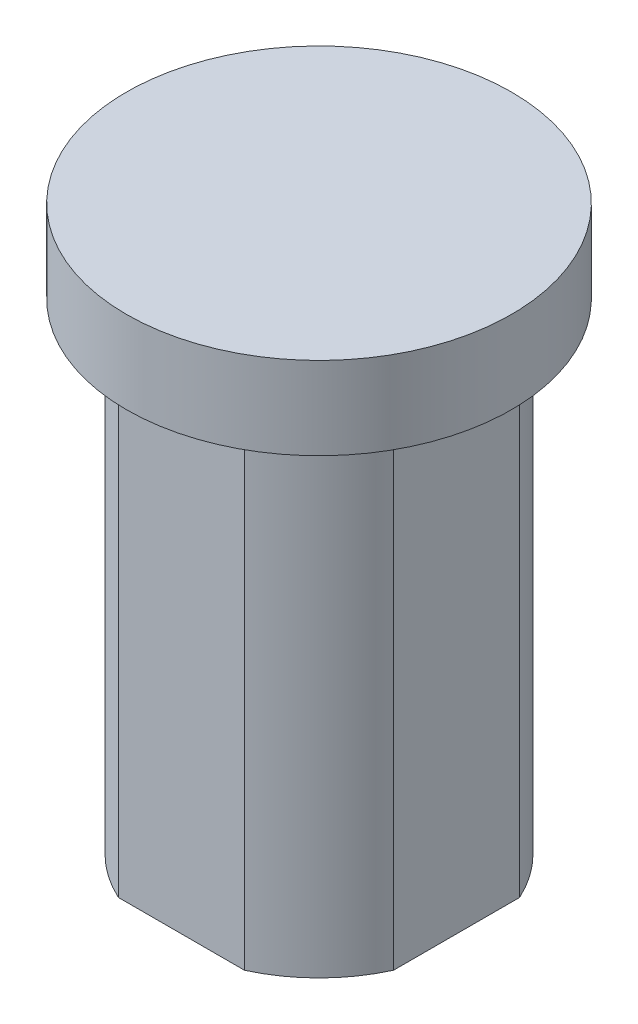
ISO-10303-21;
HEADER;
FILE_DESCRIPTION(('STEP AP214'),'2;1');
FILE_NAME('part.step','',(''),(''),'','','');
FILE_SCHEMA(('AUTOMOTIVE_DESIGN { 1 0 10303 214 1 1 1 1 }'));
ENDSEC;
DATA;
#1=APPLICATION_CONTEXT('core data for automotive mechanical design processes');
#2=APPLICATION_PROTOCOL_DEFINITION('international standard','automotive_design',2000,#1);
#3=PRODUCT_CONTEXT('',#1,'mechanical');
#4=PRODUCT('Part','Part','',(#3));
#5=PRODUCT_RELATED_PRODUCT_CATEGORY('part','',(#4));
#6=PRODUCT_DEFINITION_FORMATION('','',#4);
#7=PRODUCT_DEFINITION_CONTEXT('part definition',#1,'design');
#8=PRODUCT_DEFINITION('design','',#6,#7);
#9=PRODUCT_DEFINITION_SHAPE('','',#8);
#10=(LENGTH_UNIT() NAMED_UNIT(*) SI_UNIT(.MILLI.,.METRE.));
#11=(NAMED_UNIT(*) PLANE_ANGLE_UNIT() SI_UNIT($,.RADIAN.));
#12=(NAMED_UNIT(*) SI_UNIT($,.STERADIAN.) SOLID_ANGLE_UNIT());
#13=UNCERTAINTY_MEASURE_WITH_UNIT(LENGTH_MEASURE(1.E-05),#10,'distance_accuracy_value','');
#14=(GEOMETRIC_REPRESENTATION_CONTEXT(3) GLOBAL_UNCERTAINTY_ASSIGNED_CONTEXT((#13)) GLOBAL_UNIT_ASSIGNED_CONTEXT((#10,
#11,#12)) REPRESENTATION_CONTEXT('',''));
#15=CARTESIAN_POINT('',(0.,0.,0.));
#16=DIRECTION('',(0.,0.,1.));
#17=DIRECTION('',(1.,0.,0.));
#18=AXIS2_PLACEMENT_3D('',#15,#16,#17);
#19=CARTESIAN_POINT('',(0.,35.,0.));
#20=DIRECTION('',(0.,-1.,0.));
#21=DIRECTION('',(0.,0.,-1.));
#22=AXIS2_PLACEMENT_3D('',#19,#20,#21);
#23=CYLINDRICAL_SURFACE('',#22,11.);
#24=CARTESIAN_POINT('',(0.,0.,0.));
#25=DIRECTION('',(0.,1.,0.));
#26=DIRECTION('',(0.,0.,1.));
#27=AXIS2_PLACEMENT_3D('',#24,#25,#26);
#28=CIRCLE('',#27,11.);
#29=CARTESIAN_POINT('',(-4.58257569495584,0.,-10.));
#30=VERTEX_POINT('',#29);
#31=CARTESIAN_POINT('',(-10.,0.,-4.58257569495583));
#32=VERTEX_POINT('',#31);
#33=EDGE_CURVE('E148',#30,#32,#28,.T.);
#34=ORIENTED_EDGE('',*,*,#33,.T.);
#35=DIRECTION('',(0.,-1.,0.));
#36=VECTOR('',#35,1.);
#37=CARTESIAN_POINT('',(-10.,35.,-4.58257569495583));
#38=LINE('',#37,#36);
#39=CARTESIAN_POINT('',(-10.,35.,-4.58257569495583));
#40=VERTEX_POINT('',#39);
#41=EDGE_CURVE('E11',#40,#32,#38,.T.);
#42=ORIENTED_EDGE('',*,*,#41,.F.);
#43=CARTESIAN_POINT('',(0.,35.,0.));
#44=DIRECTION('',(0.,1.,0.));
#45=DIRECTION('',(0.,0.,1.));
#46=AXIS2_PLACEMENT_3D('',#43,#44,#45);
#47=CIRCLE('',#46,11.);
#48=CARTESIAN_POINT('',(-4.58257569495584,35.,-10.));
#49=VERTEX_POINT('',#48);
#50=EDGE_CURVE('E163',#49,#40,#47,.T.);
#51=ORIENTED_EDGE('',*,*,#50,.F.);
#52=DIRECTION('',(0.,-1.,0.));
#53=VECTOR('',#52,1.);
#54=CARTESIAN_POINT('',(-4.58257569495584,35.,-10.));
#55=LINE('',#54,#53);
#56=EDGE_CURVE('E147',#49,#30,#55,.T.);
#57=ORIENTED_EDGE('',*,*,#56,.T.);
#58=EDGE_LOOP('',(#34,#42,#51,#57));
#59=FACE_BOUND('',#58,.T.);
#60=ADVANCED_FACE('F41',(#59),#23,.T.);
#61=CARTESIAN_POINT('',(-10.,35.,4.58257569495583));
#62=DIRECTION('',(1.,0.,0.));
#63=DIRECTION('',(0.,0.,-1.));
#64=AXIS2_PLACEMENT_3D('',#61,#62,#63);
#65=PLANE('',#64);
#66=DIRECTION('',(0.,0.,1.));
#67=VECTOR('',#66,1.);
#68=CARTESIAN_POINT('',(-10.,0.,4.58257569495583));
#69=LINE('',#68,#67);
#70=CARTESIAN_POINT('',(-10.,0.,4.58257569495583));
#71=VERTEX_POINT('',#70);
#72=EDGE_CURVE('E151',#32,#71,#69,.T.);
#73=ORIENTED_EDGE('',*,*,#72,.T.);
#74=DIRECTION('',(0.,-1.,0.));
#75=VECTOR('',#74,1.);
#76=CARTESIAN_POINT('',(-10.,35.,4.58257569495583));
#77=LINE('',#76,#75);
#78=CARTESIAN_POINT('',(-10.,35.,4.58257569495583));
#79=VERTEX_POINT('',#78);
#80=EDGE_CURVE('E49',#79,#71,#77,.T.);
#81=ORIENTED_EDGE('',*,*,#80,.F.);
#82=DIRECTION('',(0.,0.,1.));
#83=VECTOR('',#82,1.);
#84=CARTESIAN_POINT('',(-10.,35.,4.58257569495583));
#85=LINE('',#84,#83);
#86=EDGE_CURVE('E99',#40,#79,#85,.T.);
#87=ORIENTED_EDGE('',*,*,#86,.F.);
#88=ORIENTED_EDGE('',*,*,#41,.T.);
#89=EDGE_LOOP('',(#73,#81,#87,#88));
#90=FACE_BOUND('',#89,.T.);
#91=ADVANCED_FACE('F209',(#90),#65,.F.);
#92=CARTESIAN_POINT('',(0.,35.,0.));
#93=DIRECTION('',(0.,-1.,0.));
#94=DIRECTION('',(0.,0.,-1.));
#95=AXIS2_PLACEMENT_3D('',#92,#93,#94);
#96=CYLINDRICAL_SURFACE('',#95,11.);
#97=CARTESIAN_POINT('',(0.,0.,0.));
#98=DIRECTION('',(0.,1.,0.));
#99=DIRECTION('',(0.,0.,1.));
#100=AXIS2_PLACEMENT_3D('',#97,#98,#99);
#101=CIRCLE('',#100,11.);
#102=CARTESIAN_POINT('',(-4.58257569495583,0.,10.));
#103=VERTEX_POINT('',#102);
#104=EDGE_CURVE('E154',#71,#103,#101,.T.);
#105=ORIENTED_EDGE('',*,*,#104,.T.);
#106=DIRECTION('',(0.,-1.,0.));
#107=VECTOR('',#106,1.);
#108=CARTESIAN_POINT('',(-4.58257569495583,35.,10.));
#109=LINE('',#108,#107);
#110=CARTESIAN_POINT('',(-4.58257569495583,35.,10.));
#111=VERTEX_POINT('',#110);
#112=EDGE_CURVE('E168',#111,#103,#109,.T.);
#113=ORIENTED_EDGE('',*,*,#112,.F.);
#114=CARTESIAN_POINT('',(0.,35.,0.));
#115=DIRECTION('',(0.,1.,0.));
#116=DIRECTION('',(0.,0.,1.));
#117=AXIS2_PLACEMENT_3D('',#114,#115,#116);
#118=CIRCLE('',#117,11.);
#119=EDGE_CURVE('E140',#79,#111,#118,.T.);
#120=ORIENTED_EDGE('',*,*,#119,.F.);
#121=ORIENTED_EDGE('',*,*,#80,.T.);
#122=EDGE_LOOP('',(#105,#113,#120,#121));
#123=FACE_BOUND('',#122,.T.);
#124=ADVANCED_FACE('F174',(#123),#96,.T.);
#125=CARTESIAN_POINT('',(4.58257569495583,35.,10.));
#126=DIRECTION('',(0.,0.,-1.));
#127=DIRECTION('',(-1.,0.,0.));
#128=AXIS2_PLACEMENT_3D('',#125,#126,#127);
#129=PLANE('',#128);
#130=DIRECTION('',(1.,0.,0.));
#131=VECTOR('',#130,1.);
#132=CARTESIAN_POINT('',(4.58257569495583,0.,10.));
#133=LINE('',#132,#131);
#134=CARTESIAN_POINT('',(4.58257569495583,0.,10.));
#135=VERTEX_POINT('',#134);
#136=EDGE_CURVE('E156',#103,#135,#133,.T.);
#137=ORIENTED_EDGE('',*,*,#136,.T.);
#138=DIRECTION('',(0.,-1.,0.));
#139=VECTOR('',#138,1.);
#140=CARTESIAN_POINT('',(4.58257569495583,35.,10.));
#141=LINE('',#140,#139);
#142=CARTESIAN_POINT('',(4.58257569495583,35.,10.));
#143=VERTEX_POINT('',#142);
#144=EDGE_CURVE('E124',#143,#135,#141,.T.);
#145=ORIENTED_EDGE('',*,*,#144,.F.);
#146=DIRECTION('',(1.,0.,0.));
#147=VECTOR('',#146,1.);
#148=CARTESIAN_POINT('',(4.58257569495583,35.,10.));
#149=LINE('',#148,#147);
#150=EDGE_CURVE('E138',#111,#143,#149,.T.);
#151=ORIENTED_EDGE('',*,*,#150,.F.);
#152=ORIENTED_EDGE('',*,*,#112,.T.);
#153=EDGE_LOOP('',(#137,#145,#151,#152));
#154=FACE_BOUND('',#153,.T.);
#155=ADVANCED_FACE('F180',(#154),#129,.F.);
#156=CARTESIAN_POINT('',(0.,35.,0.));
#157=DIRECTION('',(0.,-1.,0.));
#158=DIRECTION('',(0.,0.,-1.));
#159=AXIS2_PLACEMENT_3D('',#156,#157,#158);
#160=CYLINDRICAL_SURFACE('',#159,11.);
#161=CARTESIAN_POINT('',(0.,0.,0.));
#162=DIRECTION('',(0.,1.,0.));
#163=DIRECTION('',(0.,0.,1.));
#164=AXIS2_PLACEMENT_3D('',#161,#162,#163);
#165=CIRCLE('',#164,11.);
#166=CARTESIAN_POINT('',(10.,0.,4.58257569495583));
#167=VERTEX_POINT('',#166);
#168=EDGE_CURVE('E121',#135,#167,#165,.T.);
#169=ORIENTED_EDGE('',*,*,#168,.T.);
#170=DIRECTION('',(0.,-1.,0.));
#171=VECTOR('',#170,1.);
#172=CARTESIAN_POINT('',(10.,35.,4.58257569495583));
#173=LINE('',#172,#171);
#174=CARTESIAN_POINT('',(10.,35.,4.58257569495583));
#175=VERTEX_POINT('',#174);
#176=EDGE_CURVE('E113',#175,#167,#173,.T.);
#177=ORIENTED_EDGE('',*,*,#176,.F.);
#178=CARTESIAN_POINT('',(0.,35.,0.));
#179=DIRECTION('',(0.,1.,0.));
#180=DIRECTION('',(0.,0.,1.));
#181=AXIS2_PLACEMENT_3D('',#178,#179,#180);
#182=CIRCLE('',#181,11.);
#183=EDGE_CURVE('E118',#143,#175,#182,.T.);
#184=ORIENTED_EDGE('',*,*,#183,.F.);
#185=ORIENTED_EDGE('',*,*,#144,.T.);
#186=EDGE_LOOP('',(#169,#177,#184,#185));
#187=FACE_BOUND('',#186,.T.);
#188=ADVANCED_FACE('F115',(#187),#160,.T.);
#189=CARTESIAN_POINT('',(10.,35.,4.58257569495583));
#190=DIRECTION('',(-1.,0.,0.));
#191=DIRECTION('',(0.,0.,1.));
#192=AXIS2_PLACEMENT_3D('',#189,#190,#191);
#193=PLANE('',#192);
#194=DIRECTION('',(0.,0.,-1.));
#195=VECTOR('',#194,1.);
#196=CARTESIAN_POINT('',(10.,0.,4.58257569495583));
#197=LINE('',#196,#195);
#198=CARTESIAN_POINT('',(10.,0.,-4.58257569495583));
#199=VERTEX_POINT('',#198);
#200=EDGE_CURVE('E159',#167,#199,#197,.T.);
#201=ORIENTED_EDGE('',*,*,#200,.T.);
#202=DIRECTION('',(0.,-1.,0.));
#203=VECTOR('',#202,1.);
#204=CARTESIAN_POINT('',(10.,35.,-4.58257569495583));
#205=LINE('',#204,#203);
#206=CARTESIAN_POINT('',(10.,35.,-4.58257569495583));
#207=VERTEX_POINT('',#206);
#208=EDGE_CURVE('E125',#207,#199,#205,.T.);
#209=ORIENTED_EDGE('',*,*,#208,.F.);
#210=DIRECTION('',(0.,0.,-1.));
#211=VECTOR('',#210,1.);
#212=CARTESIAN_POINT('',(10.,35.,4.58257569495583));
#213=LINE('',#212,#211);
#214=EDGE_CURVE('E128',#175,#207,#213,.T.);
#215=ORIENTED_EDGE('',*,*,#214,.F.);
#216=ORIENTED_EDGE('',*,*,#176,.T.);
#217=EDGE_LOOP('',(#201,#209,#215,#216));
#218=FACE_BOUND('',#217,.T.);
#219=ADVANCED_FACE('F129',(#218),#193,.F.);
#220=CARTESIAN_POINT('',(0.,35.,0.));
#221=DIRECTION('',(0.,-1.,0.));
#222=DIRECTION('',(0.,0.,-1.));
#223=AXIS2_PLACEMENT_3D('',#220,#221,#222);
#224=CYLINDRICAL_SURFACE('',#223,11.);
#225=CARTESIAN_POINT('',(0.,0.,0.));
#226=DIRECTION('',(0.,1.,0.));
#227=DIRECTION('',(0.,0.,1.));
#228=AXIS2_PLACEMENT_3D('',#225,#226,#227);
#229=CIRCLE('',#228,11.);
#230=CARTESIAN_POINT('',(4.58257569495584,0.,-10.));
#231=VERTEX_POINT('',#230);
#232=EDGE_CURVE('E85',#199,#231,#229,.T.);
#233=ORIENTED_EDGE('',*,*,#232,.T.);
#234=DIRECTION('',(0.,-1.,0.));
#235=VECTOR('',#234,1.);
#236=CARTESIAN_POINT('',(4.58257569495584,35.,-10.));
#237=LINE('',#236,#235);
#238=CARTESIAN_POINT('',(4.58257569495584,35.,-10.));
#239=VERTEX_POINT('',#238);
#240=EDGE_CURVE('E57',#239,#231,#237,.T.);
#241=ORIENTED_EDGE('',*,*,#240,.F.);
#242=CARTESIAN_POINT('',(0.,35.,0.));
#243=DIRECTION('',(0.,1.,0.));
#244=DIRECTION('',(0.,0.,1.));
#245=AXIS2_PLACEMENT_3D('',#242,#243,#244);
#246=CIRCLE('',#245,11.);
#247=EDGE_CURVE('E132',#207,#239,#246,.T.);
#248=ORIENTED_EDGE('',*,*,#247,.F.);
#249=ORIENTED_EDGE('',*,*,#208,.T.);
#250=EDGE_LOOP('',(#233,#241,#248,#249));
#251=FACE_BOUND('',#250,.T.);
#252=ADVANCED_FACE('F215',(#251),#224,.T.);
#253=CARTESIAN_POINT('',(4.58257569495584,35.,-10.));
#254=DIRECTION('',(0.,0.,1.));
#255=DIRECTION('',(1.,0.,0.));
#256=AXIS2_PLACEMENT_3D('',#253,#254,#255);
#257=PLANE('',#256);
#258=DIRECTION('',(-1.,0.,0.));
#259=VECTOR('',#258,1.);
#260=CARTESIAN_POINT('',(4.58257569495584,0.,-10.));
#261=LINE('',#260,#259);
#262=EDGE_CURVE('E91',#231,#30,#261,.T.);
#263=ORIENTED_EDGE('',*,*,#262,.T.);
#264=ORIENTED_EDGE('',*,*,#56,.F.);
#265=DIRECTION('',(-1.,0.,0.));
#266=VECTOR('',#265,1.);
#267=CARTESIAN_POINT('',(4.58257569495584,35.,-10.));
#268=LINE('',#267,#266);
#269=EDGE_CURVE('E145',#239,#49,#268,.T.);
#270=ORIENTED_EDGE('',*,*,#269,.F.);
#271=ORIENTED_EDGE('',*,*,#240,.T.);
#272=EDGE_LOOP('',(#263,#264,#270,#271));
#273=FACE_BOUND('',#272,.T.);
#274=ADVANCED_FACE('F205',(#273),#257,.F.);
#275=CARTESIAN_POINT('',(0.,0.,0.));
#276=DIRECTION('',(0.,1.,0.));
#277=DIRECTION('',(0.,0.,1.));
#278=AXIS2_PLACEMENT_3D('',#275,#276,#277);
#279=PLANE('',#278);
#280=ORIENTED_EDGE('',*,*,#33,.F.);
#281=ORIENTED_EDGE('',*,*,#262,.F.);
#282=ORIENTED_EDGE('',*,*,#232,.F.);
#283=ORIENTED_EDGE('',*,*,#200,.F.);
#284=ORIENTED_EDGE('',*,*,#168,.F.);
#285=ORIENTED_EDGE('',*,*,#136,.F.);
#286=ORIENTED_EDGE('',*,*,#104,.F.);
#287=ORIENTED_EDGE('',*,*,#72,.F.);
#288=EDGE_LOOP('',(#280,#281,#282,#283,#284,#285,#286,#287));
#289=FACE_BOUND('',#288,.T.);
#290=ADVANCED_FACE('F178',(#289),#279,.F.);
#291=CARTESIAN_POINT('',(0.,35.,0.));
#292=DIRECTION('',(0.,1.,0.));
#293=DIRECTION('',(0.,0.,1.));
#294=AXIS2_PLACEMENT_3D('',#291,#292,#293);
#295=PLANE('',#294);
#296=CARTESIAN_POINT('',(0.,35.,0.));
#297=DIRECTION('',(0.,1.,0.));
#298=DIRECTION('',(0.,0.,1.));
#299=AXIS2_PLACEMENT_3D('',#296,#297,#298);
#300=CIRCLE('',#299,14.);
#301=CARTESIAN_POINT('',(0.,35.,14.));
#302=VERTEX_POINT('',#301);
#303=EDGE_CURVE('E185',#302,#302,#300,.T.);
#304=ORIENTED_EDGE('',*,*,#303,.F.);
#305=EDGE_LOOP('',(#304));
#306=FACE_BOUND('',#305,.T.);
#307=ORIENTED_EDGE('',*,*,#269,.T.);
#308=ORIENTED_EDGE('',*,*,#50,.T.);
#309=ORIENTED_EDGE('',*,*,#86,.T.);
#310=ORIENTED_EDGE('',*,*,#119,.T.);
#311=ORIENTED_EDGE('',*,*,#150,.T.);
#312=ORIENTED_EDGE('',*,*,#183,.T.);
#313=ORIENTED_EDGE('',*,*,#214,.T.);
#314=ORIENTED_EDGE('',*,*,#247,.T.);
#315=EDGE_LOOP('',(#307,#308,#309,#310,#311,#312,#313,#314));
#316=FACE_BOUND('',#315,.T.);
#317=ADVANCED_FACE('F135',(#306,#316),#295,.F.);
#318=CARTESIAN_POINT('',(0.,41.,0.));
#319=DIRECTION('',(0.,-1.,0.));
#320=DIRECTION('',(0.,0.,-1.));
#321=AXIS2_PLACEMENT_3D('',#318,#319,#320);
#322=CYLINDRICAL_SURFACE('',#321,14.);
#323=CARTESIAN_POINT('',(0.,41.,0.));
#324=DIRECTION('',(0.,1.,0.));
#325=DIRECTION('',(0.,0.,1.));
#326=AXIS2_PLACEMENT_3D('',#323,#324,#325);
#327=CIRCLE('',#326,14.);
#328=CARTESIAN_POINT('',(0.,41.,14.));
#329=VERTEX_POINT('',#328);
#330=EDGE_CURVE('E152',#329,#329,#327,.T.);
#331=ORIENTED_EDGE('',*,*,#330,.F.);
#332=EDGE_LOOP('',(#331));
#333=FACE_BOUND('',#332,.T.);
#334=ORIENTED_EDGE('',*,*,#303,.T.);
#335=EDGE_LOOP('',(#334));
#336=FACE_BOUND('',#335,.T.);
#337=ADVANCED_FACE('F193',(#333,#336),#322,.T.);
#338=CARTESIAN_POINT('',(0.,41.,0.));
#339=DIRECTION('',(0.,1.,0.));
#340=DIRECTION('',(0.,0.,1.));
#341=AXIS2_PLACEMENT_3D('',#338,#339,#340);
#342=PLANE('',#341);
#343=ORIENTED_EDGE('',*,*,#330,.T.);
#344=EDGE_LOOP('',(#343));
#345=FACE_BOUND('',#344,.T.);
#346=ADVANCED_FACE('F191',(#345),#342,.T.);
#347=CLOSED_SHELL('',(#60,#91,#124,#155,#188,#219,#252,#274,#290,#317,#337,#346));
#348=MANIFOLD_SOLID_BREP('B2',#347);
#349=ADVANCED_BREP_SHAPE_REPRESENTATION('',(#18,#348),#14);
#350=SHAPE_DEFINITION_REPRESENTATION(#9,#349);
ENDSEC;
END-ISO-10303-21;
